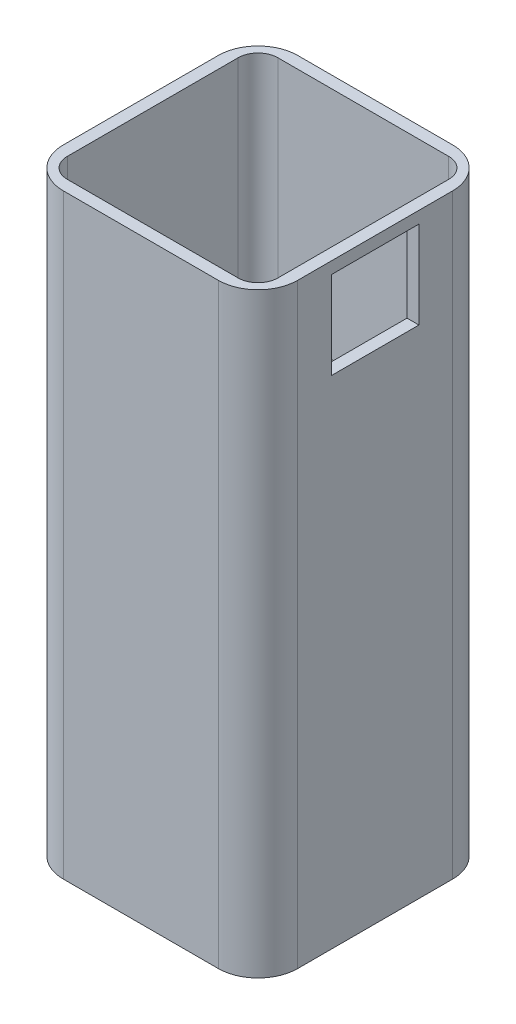
ISO-10303-21;
HEADER;
FILE_DESCRIPTION(('STEP AP214'),'2;1');
FILE_NAME('part.step','',(''),(''),'','','');
FILE_SCHEMA(('AUTOMOTIVE_DESIGN { 1 0 10303 214 1 1 1 1 }'));
ENDSEC;
DATA;
#1=APPLICATION_CONTEXT('core data for automotive mechanical design processes');
#2=APPLICATION_PROTOCOL_DEFINITION('international standard','automotive_design',2000,#1);
#3=PRODUCT_CONTEXT('',#1,'mechanical');
#4=PRODUCT('Part','Part','',(#3));
#5=PRODUCT_RELATED_PRODUCT_CATEGORY('part','',(#4));
#6=PRODUCT_DEFINITION_FORMATION('','',#4);
#7=PRODUCT_DEFINITION_CONTEXT('part definition',#1,'design');
#8=PRODUCT_DEFINITION('design','',#6,#7);
#9=PRODUCT_DEFINITION_SHAPE('','',#8);
#10=(LENGTH_UNIT() NAMED_UNIT(*) SI_UNIT(.MILLI.,.METRE.));
#11=(NAMED_UNIT(*) PLANE_ANGLE_UNIT() SI_UNIT($,.RADIAN.));
#12=(NAMED_UNIT(*) SI_UNIT($,.STERADIAN.) SOLID_ANGLE_UNIT());
#13=UNCERTAINTY_MEASURE_WITH_UNIT(LENGTH_MEASURE(1.E-05),#10,'distance_accuracy_value','');
#14=(GEOMETRIC_REPRESENTATION_CONTEXT(3) GLOBAL_UNCERTAINTY_ASSIGNED_CONTEXT((#13)) GLOBAL_UNIT_ASSIGNED_CONTEXT((#10,
#11,#12)) REPRESENTATION_CONTEXT('',''));
#15=CARTESIAN_POINT('',(0.,0.,0.));
#16=DIRECTION('',(0.,0.,1.));
#17=DIRECTION('',(1.,0.,0.));
#18=AXIS2_PLACEMENT_3D('',#15,#16,#17);
#19=CARTESIAN_POINT('',(0.,150.,0.));
#20=DIRECTION('',(0.,-1.,0.));
#21=DIRECTION('',(0.,0.,-1.));
#22=AXIS2_PLACEMENT_3D('',#19,#20,#21);
#23=PLANE('',#22);
#24=DIRECTION('',(0.,0.,-1.));
#25=VECTOR('',#24,1.);
#26=CARTESIAN_POINT('',(29.5,150.,29.5));
#27=LINE('',#26,#25);
#28=CARTESIAN_POINT('',(29.5,150.,19.5));
#29=VERTEX_POINT('',#28);
#30=CARTESIAN_POINT('',(29.5,150.,-19.5));
#31=VERTEX_POINT('',#30);
#32=EDGE_CURVE('E323',#29,#31,#27,.T.);
#33=ORIENTED_EDGE('',*,*,#32,.T.);
#34=CARTESIAN_POINT('',(19.5,150.,-19.5));
#35=DIRECTION('',(0.,-1.,0.));
#36=DIRECTION('',(0.,0.,-1.));
#37=AXIS2_PLACEMENT_3D('',#34,#35,#36);
#38=CIRCLE('',#37,10.);
#39=CARTESIAN_POINT('',(19.5,150.,-29.5));
#40=VERTEX_POINT('',#39);
#41=EDGE_CURVE('E389',#31,#40,#38,.F.);
#42=ORIENTED_EDGE('',*,*,#41,.T.);
#43=DIRECTION('',(-1.,0.,0.));
#44=VECTOR('',#43,1.);
#45=CARTESIAN_POINT('',(-29.5,150.,-29.5));
#46=LINE('',#45,#44);
#47=CARTESIAN_POINT('',(-19.5,150.,-29.5));
#48=VERTEX_POINT('',#47);
#49=EDGE_CURVE('E327',#40,#48,#46,.T.);
#50=ORIENTED_EDGE('',*,*,#49,.T.);
#51=CARTESIAN_POINT('',(-19.5,150.,-19.5));
#52=DIRECTION('',(0.,-1.,0.));
#53=DIRECTION('',(0.,0.,-1.));
#54=AXIS2_PLACEMENT_3D('',#51,#52,#53);
#55=CIRCLE('',#54,10.);
#56=CARTESIAN_POINT('',(-29.5,150.,-19.5));
#57=VERTEX_POINT('',#56);
#58=EDGE_CURVE('E380',#48,#57,#55,.F.);
#59=ORIENTED_EDGE('',*,*,#58,.T.);
#60=DIRECTION('',(0.,0.,1.));
#61=VECTOR('',#60,1.);
#62=CARTESIAN_POINT('',(-29.5,150.,29.5));
#63=LINE('',#62,#61);
#64=CARTESIAN_POINT('',(-29.5,150.,19.5));
#65=VERTEX_POINT('',#64);
#66=EDGE_CURVE('E332',#57,#65,#63,.T.);
#67=ORIENTED_EDGE('',*,*,#66,.T.);
#68=CARTESIAN_POINT('',(-19.5,150.,19.5));
#69=DIRECTION('',(0.,-1.,0.));
#70=DIRECTION('',(0.,0.,-1.));
#71=AXIS2_PLACEMENT_3D('',#68,#69,#70);
#72=CIRCLE('',#71,10.);
#73=CARTESIAN_POINT('',(-19.5,150.,29.5));
#74=VERTEX_POINT('',#73);
#75=EDGE_CURVE('E383',#65,#74,#72,.F.);
#76=ORIENTED_EDGE('',*,*,#75,.T.);
#77=DIRECTION('',(1.,0.,0.));
#78=VECTOR('',#77,1.);
#79=CARTESIAN_POINT('',(-29.5,150.,29.5));
#80=LINE('',#79,#78);
#81=CARTESIAN_POINT('',(19.5,150.,29.5));
#82=VERTEX_POINT('',#81);
#83=EDGE_CURVE('E336',#74,#82,#80,.T.);
#84=ORIENTED_EDGE('',*,*,#83,.T.);
#85=CARTESIAN_POINT('',(19.5,150.,19.5));
#86=DIRECTION('',(0.,-1.,0.));
#87=DIRECTION('',(0.,0.,-1.));
#88=AXIS2_PLACEMENT_3D('',#85,#86,#87);
#89=CIRCLE('',#88,10.);
#90=EDGE_CURVE('E386',#82,#29,#89,.F.);
#91=ORIENTED_EDGE('',*,*,#90,.T.);
#92=EDGE_LOOP('',(#33,#42,#50,#59,#67,#76,#84,#91));
#93=FACE_BOUND('',#92,.T.);
#94=DIRECTION('',(0.,0.,-1.));
#95=VECTOR('',#94,1.);
#96=CARTESIAN_POINT('',(26.5,150.,26.5));
#97=LINE('',#96,#95);
#98=CARTESIAN_POINT('',(26.5,150.,21.5));
#99=VERTEX_POINT('',#98);
#100=CARTESIAN_POINT('',(26.5,150.,-21.5));
#101=VERTEX_POINT('',#100);
#102=EDGE_CURVE('E291',#99,#101,#97,.T.);
#103=ORIENTED_EDGE('',*,*,#102,.F.);
#104=CARTESIAN_POINT('',(21.5,150.,21.5));
#105=DIRECTION('',(0.,-1.,0.));
#106=DIRECTION('',(0.,0.,-1.));
#107=AXIS2_PLACEMENT_3D('',#104,#105,#106);
#108=CIRCLE('',#107,5.);
#109=CARTESIAN_POINT('',(21.5,150.,26.5));
#110=VERTEX_POINT('',#109);
#111=EDGE_CURVE('E449',#99,#110,#108,.T.);
#112=ORIENTED_EDGE('',*,*,#111,.T.);
#113=DIRECTION('',(1.,0.,0.));
#114=VECTOR('',#113,1.);
#115=CARTESIAN_POINT('',(-26.5,150.,26.5));
#116=LINE('',#115,#114);
#117=CARTESIAN_POINT('',(-21.5,150.,26.5));
#118=VERTEX_POINT('',#117);
#119=EDGE_CURVE('E304',#118,#110,#116,.T.);
#120=ORIENTED_EDGE('',*,*,#119,.F.);
#121=CARTESIAN_POINT('',(-21.5,150.,21.5));
#122=DIRECTION('',(0.,-1.,0.));
#123=DIRECTION('',(0.,0.,-1.));
#124=AXIS2_PLACEMENT_3D('',#121,#122,#123);
#125=CIRCLE('',#124,5.);
#126=CARTESIAN_POINT('',(-26.5,150.,21.5));
#127=VERTEX_POINT('',#126);
#128=EDGE_CURVE('E443',#118,#127,#125,.T.);
#129=ORIENTED_EDGE('',*,*,#128,.T.);
#130=DIRECTION('',(0.,0.,1.));
#131=VECTOR('',#130,1.);
#132=CARTESIAN_POINT('',(-26.5,150.,26.5));
#133=LINE('',#132,#131);
#134=CARTESIAN_POINT('',(-26.5,150.,-21.5));
#135=VERTEX_POINT('',#134);
#136=EDGE_CURVE('E300',#135,#127,#133,.T.);
#137=ORIENTED_EDGE('',*,*,#136,.F.);
#138=CARTESIAN_POINT('',(-21.5,150.,-21.5));
#139=DIRECTION('',(0.,-1.,0.));
#140=DIRECTION('',(0.,0.,-1.));
#141=AXIS2_PLACEMENT_3D('',#138,#139,#140);
#142=CIRCLE('',#141,5.);
#143=CARTESIAN_POINT('',(-21.5,150.,-26.5));
#144=VERTEX_POINT('',#143);
#145=EDGE_CURVE('E437',#135,#144,#142,.T.);
#146=ORIENTED_EDGE('',*,*,#145,.T.);
#147=DIRECTION('',(-1.,0.,0.));
#148=VECTOR('',#147,1.);
#149=CARTESIAN_POINT('',(-26.5,150.,-26.5));
#150=LINE('',#149,#148);
#151=CARTESIAN_POINT('',(21.5,150.,-26.5));
#152=VERTEX_POINT('',#151);
#153=EDGE_CURVE('E295',#152,#144,#150,.T.);
#154=ORIENTED_EDGE('',*,*,#153,.F.);
#155=CARTESIAN_POINT('',(21.5,150.,-21.5));
#156=DIRECTION('',(0.,-1.,0.));
#157=DIRECTION('',(0.,0.,-1.));
#158=AXIS2_PLACEMENT_3D('',#155,#156,#157);
#159=CIRCLE('',#158,5.);
#160=EDGE_CURVE('E11',#152,#101,#159,.T.);
#161=ORIENTED_EDGE('',*,*,#160,.T.);
#162=EDGE_LOOP('',(#103,#112,#120,#129,#137,#146,#154,#161));
#163=FACE_BOUND('',#162,.T.);
#164=ADVANCED_FACE('F39',(#93,#163),#23,.F.);
#165=CARTESIAN_POINT('',(0.,0.,0.));
#166=DIRECTION('',(0.,-1.,0.));
#167=DIRECTION('',(0.,0.,-1.));
#168=AXIS2_PLACEMENT_3D('',#165,#166,#167);
#169=PLANE('',#168);
#170=DIRECTION('',(-1.,0.,0.));
#171=VECTOR('',#170,1.);
#172=CARTESIAN_POINT('',(-29.5,0.,-29.5));
#173=LINE('',#172,#171);
#174=CARTESIAN_POINT('',(19.5,0.,-29.5));
#175=VERTEX_POINT('',#174);
#176=CARTESIAN_POINT('',(-19.5,0.,-29.5));
#177=VERTEX_POINT('',#176);
#178=EDGE_CURVE('E344',#175,#177,#173,.T.);
#179=ORIENTED_EDGE('',*,*,#178,.F.);
#180=CARTESIAN_POINT('',(19.5,0.,-19.5));
#181=DIRECTION('',(0.,-1.,0.));
#182=DIRECTION('',(0.,0.,-1.));
#183=AXIS2_PLACEMENT_3D('',#180,#181,#182);
#184=CIRCLE('',#183,10.);
#185=CARTESIAN_POINT('',(29.5,0.,-19.5));
#186=VERTEX_POINT('',#185);
#187=EDGE_CURVE('E370',#175,#186,#184,.T.);
#188=ORIENTED_EDGE('',*,*,#187,.T.);
#189=DIRECTION('',(0.,0.,-1.));
#190=VECTOR('',#189,1.);
#191=CARTESIAN_POINT('',(29.5,0.,29.5));
#192=LINE('',#191,#190);
#193=CARTESIAN_POINT('',(29.5,0.,19.5));
#194=VERTEX_POINT('',#193);
#195=EDGE_CURVE('E308',#194,#186,#192,.T.);
#196=ORIENTED_EDGE('',*,*,#195,.F.);
#197=CARTESIAN_POINT('',(19.5,0.,19.5));
#198=DIRECTION('',(0.,-1.,0.));
#199=DIRECTION('',(0.,0.,-1.));
#200=AXIS2_PLACEMENT_3D('',#197,#198,#199);
#201=CIRCLE('',#200,10.);
#202=CARTESIAN_POINT('',(19.5,0.,29.5));
#203=VERTEX_POINT('',#202);
#204=EDGE_CURVE('E367',#194,#203,#201,.T.);
#205=ORIENTED_EDGE('',*,*,#204,.T.);
#206=DIRECTION('',(1.,0.,0.));
#207=VECTOR('',#206,1.);
#208=CARTESIAN_POINT('',(-29.5,0.,29.5));
#209=LINE('',#208,#207);
#210=CARTESIAN_POINT('',(-19.5,0.,29.5));
#211=VERTEX_POINT('',#210);
#212=EDGE_CURVE('E328',#211,#203,#209,.T.);
#213=ORIENTED_EDGE('',*,*,#212,.F.);
#214=CARTESIAN_POINT('',(-19.5,0.,19.5));
#215=DIRECTION('',(0.,-1.,0.));
#216=DIRECTION('',(0.,0.,-1.));
#217=AXIS2_PLACEMENT_3D('',#214,#215,#216);
#218=CIRCLE('',#217,10.);
#219=CARTESIAN_POINT('',(-29.5,0.,19.5));
#220=VERTEX_POINT('',#219);
#221=EDGE_CURVE('E364',#211,#220,#218,.T.);
#222=ORIENTED_EDGE('',*,*,#221,.T.);
#223=DIRECTION('',(0.,0.,1.));
#224=VECTOR('',#223,1.);
#225=CARTESIAN_POINT('',(-29.5,0.,29.5));
#226=LINE('',#225,#224);
#227=CARTESIAN_POINT('',(-29.5,0.,-19.5));
#228=VERTEX_POINT('',#227);
#229=EDGE_CURVE('E348',#228,#220,#226,.T.);
#230=ORIENTED_EDGE('',*,*,#229,.F.);
#231=CARTESIAN_POINT('',(-19.5,0.,-19.5));
#232=DIRECTION('',(0.,-1.,0.));
#233=DIRECTION('',(0.,0.,-1.));
#234=AXIS2_PLACEMENT_3D('',#231,#232,#233);
#235=CIRCLE('',#234,10.);
#236=EDGE_CURVE('E361',#228,#177,#235,.T.);
#237=ORIENTED_EDGE('',*,*,#236,.T.);
#238=EDGE_LOOP('',(#179,#188,#196,#205,#213,#222,#230,#237));
#239=FACE_BOUND('',#238,.T.);
#240=DIRECTION('',(0.,0.,1.));
#241=VECTOR('',#240,1.);
#242=CARTESIAN_POINT('',(-26.5,0.,26.5));
#243=LINE('',#242,#241);
#244=CARTESIAN_POINT('',(-26.5,0.,-21.5));
#245=VERTEX_POINT('',#244);
#246=CARTESIAN_POINT('',(-26.5,0.,21.5));
#247=VERTEX_POINT('',#246);
#248=EDGE_CURVE('E316',#245,#247,#243,.T.);
#249=ORIENTED_EDGE('',*,*,#248,.T.);
#250=CARTESIAN_POINT('',(-21.5,0.,21.5));
#251=DIRECTION('',(0.,-1.,0.));
#252=DIRECTION('',(0.,0.,-1.));
#253=AXIS2_PLACEMENT_3D('',#250,#251,#252);
#254=CIRCLE('',#253,5.);
#255=CARTESIAN_POINT('',(-21.5,0.,26.5));
#256=VERTEX_POINT('',#255);
#257=EDGE_CURVE('E440',#247,#256,#254,.F.);
#258=ORIENTED_EDGE('',*,*,#257,.T.);
#259=DIRECTION('',(1.,0.,0.));
#260=VECTOR('',#259,1.);
#261=CARTESIAN_POINT('',(-26.5,0.,26.5));
#262=LINE('',#261,#260);
#263=CARTESIAN_POINT('',(21.5,0.,26.5));
#264=VERTEX_POINT('',#263);
#265=EDGE_CURVE('E296',#256,#264,#262,.T.);
#266=ORIENTED_EDGE('',*,*,#265,.T.);
#267=CARTESIAN_POINT('',(21.5,0.,21.5));
#268=DIRECTION('',(0.,-1.,0.));
#269=DIRECTION('',(0.,0.,-1.));
#270=AXIS2_PLACEMENT_3D('',#267,#268,#269);
#271=CIRCLE('',#270,5.);
#272=CARTESIAN_POINT('',(26.5,0.,21.5));
#273=VERTEX_POINT('',#272);
#274=EDGE_CURVE('E446',#264,#273,#271,.F.);
#275=ORIENTED_EDGE('',*,*,#274,.T.);
#276=DIRECTION('',(0.,0.,-1.));
#277=VECTOR('',#276,1.);
#278=CARTESIAN_POINT('',(26.5,0.,26.5));
#279=LINE('',#278,#277);
#280=CARTESIAN_POINT('',(26.5,0.,-21.5));
#281=VERTEX_POINT('',#280);
#282=EDGE_CURVE('E281',#273,#281,#279,.T.);
#283=ORIENTED_EDGE('',*,*,#282,.T.);
#284=CARTESIAN_POINT('',(21.5,0.,-21.5));
#285=DIRECTION('',(0.,-1.,0.));
#286=DIRECTION('',(0.,0.,-1.));
#287=AXIS2_PLACEMENT_3D('',#284,#285,#286);
#288=CIRCLE('',#287,5.);
#289=CARTESIAN_POINT('',(21.5,0.,-26.5));
#290=VERTEX_POINT('',#289);
#291=EDGE_CURVE('E48',#281,#290,#288,.F.);
#292=ORIENTED_EDGE('',*,*,#291,.T.);
#293=DIRECTION('',(-1.,0.,0.));
#294=VECTOR('',#293,1.);
#295=CARTESIAN_POINT('',(-26.5,0.,-26.5));
#296=LINE('',#295,#294);
#297=CARTESIAN_POINT('',(-21.5,0.,-26.5));
#298=VERTEX_POINT('',#297);
#299=EDGE_CURVE('E312',#290,#298,#296,.T.);
#300=ORIENTED_EDGE('',*,*,#299,.T.);
#301=CARTESIAN_POINT('',(-21.5,0.,-21.5));
#302=DIRECTION('',(0.,-1.,0.));
#303=DIRECTION('',(0.,0.,-1.));
#304=AXIS2_PLACEMENT_3D('',#301,#302,#303);
#305=CIRCLE('',#304,5.);
#306=EDGE_CURVE('E434',#298,#245,#305,.F.);
#307=ORIENTED_EDGE('',*,*,#306,.T.);
#308=EDGE_LOOP('',(#249,#258,#266,#275,#283,#292,#300,#307));
#309=FACE_BOUND('',#308,.T.);
#310=ADVANCED_FACE('F454',(#239,#309),#169,.T.);
#311=CARTESIAN_POINT('',(29.5,150.,29.5));
#312=DIRECTION('',(-1.,0.,0.));
#313=DIRECTION('',(0.,0.,1.));
#314=AXIS2_PLACEMENT_3D('',#311,#312,#313);
#315=PLANE('',#314);
#316=DIRECTION('',(0.,0.,1.));
#317=VECTOR('',#316,1.);
#318=CARTESIAN_POINT('',(29.5,147.,11.));
#319=LINE('',#318,#317);
#320=CARTESIAN_POINT('',(29.5,147.,-11.));
#321=VERTEX_POINT('',#320);
#322=CARTESIAN_POINT('',(29.5,147.,11.));
#323=VERTEX_POINT('',#322);
#324=EDGE_CURVE('E225',#321,#323,#319,.T.);
#325=ORIENTED_EDGE('',*,*,#324,.F.);
#326=DIRECTION('',(0.,1.,0.));
#327=VECTOR('',#326,1.);
#328=CARTESIAN_POINT('',(29.5,125.,-11.));
#329=LINE('',#328,#327);
#330=CARTESIAN_POINT('',(29.5,125.,-11.));
#331=VERTEX_POINT('',#330);
#332=EDGE_CURVE('E55',#331,#321,#329,.T.);
#333=ORIENTED_EDGE('',*,*,#332,.F.);
#334=DIRECTION('',(0.,0.,-1.));
#335=VECTOR('',#334,1.);
#336=CARTESIAN_POINT('',(29.5,125.,11.));
#337=LINE('',#336,#335);
#338=CARTESIAN_POINT('',(29.5,125.,11.));
#339=VERTEX_POINT('',#338);
#340=EDGE_CURVE('E211',#339,#331,#337,.T.);
#341=ORIENTED_EDGE('',*,*,#340,.F.);
#342=DIRECTION('',(0.,-1.,0.));
#343=VECTOR('',#342,1.);
#344=CARTESIAN_POINT('',(29.5,125.,11.));
#345=LINE('',#344,#343);
#346=EDGE_CURVE('E220',#323,#339,#345,.T.);
#347=ORIENTED_EDGE('',*,*,#346,.F.);
#348=EDGE_LOOP('',(#325,#333,#341,#347));
#349=FACE_BOUND('',#348,.T.);
#350=ORIENTED_EDGE('',*,*,#195,.T.);
#351=DIRECTION('',(0.,-1.,0.));
#352=VECTOR('',#351,1.);
#353=CARTESIAN_POINT('',(29.5,150.,-19.5));
#354=LINE('',#353,#352);
#355=EDGE_CURVE('E377',#186,#31,#354,.F.);
#356=ORIENTED_EDGE('',*,*,#355,.T.);
#357=ORIENTED_EDGE('',*,*,#32,.F.);
#358=DIRECTION('',(0.,-1.,0.));
#359=VECTOR('',#358,1.);
#360=CARTESIAN_POINT('',(29.5,150.,19.5));
#361=LINE('',#360,#359);
#362=EDGE_CURVE('E373',#29,#194,#361,.T.);
#363=ORIENTED_EDGE('',*,*,#362,.T.);
#364=EDGE_LOOP('',(#350,#356,#357,#363));
#365=FACE_BOUND('',#364,.T.);
#366=ADVANCED_FACE('F223',(#349,#365),#315,.F.);
#367=CARTESIAN_POINT('',(-29.5,150.,-29.5));
#368=DIRECTION('',(0.,0.,1.));
#369=DIRECTION('',(1.,0.,0.));
#370=AXIS2_PLACEMENT_3D('',#367,#368,#369);
#371=PLANE('',#370);
#372=DIRECTION('',(1.,0.,0.));
#373=VECTOR('',#372,1.);
#374=CARTESIAN_POINT('',(11.,91.,-29.5));
#375=LINE('',#374,#373);
#376=CARTESIAN_POINT('',(-11.,91.,-29.5));
#377=VERTEX_POINT('',#376);
#378=CARTESIAN_POINT('',(11.,91.,-29.5));
#379=VERTEX_POINT('',#378);
#380=EDGE_CURVE('E267',#377,#379,#375,.T.);
#381=ORIENTED_EDGE('',*,*,#380,.F.);
#382=DIRECTION('',(0.,1.,0.));
#383=VECTOR('',#382,1.);
#384=CARTESIAN_POINT('',(-11.,69.,-29.5));
#385=LINE('',#384,#383);
#386=CARTESIAN_POINT('',(-11.,69.,-29.5));
#387=VERTEX_POINT('',#386);
#388=EDGE_CURVE('E219',#387,#377,#385,.T.);
#389=ORIENTED_EDGE('',*,*,#388,.F.);
#390=DIRECTION('',(-1.,0.,0.));
#391=VECTOR('',#390,1.);
#392=CARTESIAN_POINT('',(11.,69.,-29.5));
#393=LINE('',#392,#391);
#394=CARTESIAN_POINT('',(11.,69.,-29.5));
#395=VERTEX_POINT('',#394);
#396=EDGE_CURVE('E252',#395,#387,#393,.T.);
#397=ORIENTED_EDGE('',*,*,#396,.F.);
#398=DIRECTION('',(0.,-1.,0.));
#399=VECTOR('',#398,1.);
#400=CARTESIAN_POINT('',(11.,69.,-29.5));
#401=LINE('',#400,#399);
#402=EDGE_CURVE('E271',#379,#395,#401,.T.);
#403=ORIENTED_EDGE('',*,*,#402,.F.);
#404=EDGE_LOOP('',(#381,#389,#397,#403));
#405=FACE_BOUND('',#404,.T.);
#406=ORIENTED_EDGE('',*,*,#49,.F.);
#407=DIRECTION('',(0.,-1.,0.));
#408=VECTOR('',#407,1.);
#409=CARTESIAN_POINT('',(19.5,150.,-29.5));
#410=LINE('',#409,#408);
#411=EDGE_CURVE('E357',#40,#175,#410,.T.);
#412=ORIENTED_EDGE('',*,*,#411,.T.);
#413=ORIENTED_EDGE('',*,*,#178,.T.);
#414=DIRECTION('',(0.,-1.,0.));
#415=VECTOR('',#414,1.);
#416=CARTESIAN_POINT('',(-19.5,150.,-29.5));
#417=LINE('',#416,#415);
#418=EDGE_CURVE('E340',#177,#48,#417,.F.);
#419=ORIENTED_EDGE('',*,*,#418,.T.);
#420=EDGE_LOOP('',(#406,#412,#413,#419));
#421=FACE_BOUND('',#420,.T.);
#422=ADVANCED_FACE('F519',(#405,#421),#371,.F.);
#423=CARTESIAN_POINT('',(-29.5,150.,29.5));
#424=DIRECTION('',(1.,0.,0.));
#425=DIRECTION('',(0.,0.,-1.));
#426=AXIS2_PLACEMENT_3D('',#423,#424,#425);
#427=PLANE('',#426);
#428=ORIENTED_EDGE('',*,*,#229,.T.);
#429=DIRECTION('',(0.,-1.,0.));
#430=VECTOR('',#429,1.);
#431=CARTESIAN_POINT('',(-29.5,150.,19.5));
#432=LINE('',#431,#430);
#433=EDGE_CURVE('E403',#220,#65,#432,.F.);
#434=ORIENTED_EDGE('',*,*,#433,.T.);
#435=ORIENTED_EDGE('',*,*,#66,.F.);
#436=DIRECTION('',(0.,-1.,0.));
#437=VECTOR('',#436,1.);
#438=CARTESIAN_POINT('',(-29.5,150.,-19.5));
#439=LINE('',#438,#437);
#440=EDGE_CURVE('E399',#57,#228,#439,.T.);
#441=ORIENTED_EDGE('',*,*,#440,.T.);
#442=EDGE_LOOP('',(#428,#434,#435,#441));
#443=FACE_BOUND('',#442,.T.);
#444=ADVANCED_FACE('F515',(#443),#427,.F.);
#445=CARTESIAN_POINT('',(-29.5,150.,29.5));
#446=DIRECTION('',(0.,0.,-1.));
#447=DIRECTION('',(-1.,0.,0.));
#448=AXIS2_PLACEMENT_3D('',#445,#446,#447);
#449=PLANE('',#448);
#450=ORIENTED_EDGE('',*,*,#212,.T.);
#451=DIRECTION('',(0.,-1.,0.));
#452=VECTOR('',#451,1.);
#453=CARTESIAN_POINT('',(19.5,150.,29.5));
#454=LINE('',#453,#452);
#455=EDGE_CURVE('E396',#203,#82,#454,.F.);
#456=ORIENTED_EDGE('',*,*,#455,.T.);
#457=ORIENTED_EDGE('',*,*,#83,.F.);
#458=DIRECTION('',(0.,-1.,0.));
#459=VECTOR('',#458,1.);
#460=CARTESIAN_POINT('',(-19.5,150.,29.5));
#461=LINE('',#460,#459);
#462=EDGE_CURVE('E392',#74,#211,#461,.T.);
#463=ORIENTED_EDGE('',*,*,#462,.T.);
#464=EDGE_LOOP('',(#450,#456,#457,#463));
#465=FACE_BOUND('',#464,.T.);
#466=ADVANCED_FACE('F512',(#465),#449,.F.);
#467=CARTESIAN_POINT('',(26.5,150.,26.5));
#468=DIRECTION('',(-1.,0.,0.));
#469=DIRECTION('',(0.,0.,1.));
#470=AXIS2_PLACEMENT_3D('',#467,#468,#469);
#471=PLANE('',#470);
#472=DIRECTION('',(0.,1.,0.));
#473=VECTOR('',#472,1.);
#474=CARTESIAN_POINT('',(26.5,125.,-11.));
#475=LINE('',#474,#473);
#476=CARTESIAN_POINT('',(26.5,125.,-11.));
#477=VERTEX_POINT('',#476);
#478=CARTESIAN_POINT('',(26.5,147.,-11.));
#479=VERTEX_POINT('',#478);
#480=EDGE_CURVE('E203',#477,#479,#475,.T.);
#481=ORIENTED_EDGE('',*,*,#480,.T.);
#482=DIRECTION('',(0.,0.,1.));
#483=VECTOR('',#482,1.);
#484=CARTESIAN_POINT('',(26.5,147.,11.));
#485=LINE('',#484,#483);
#486=CARTESIAN_POINT('',(26.5,147.,11.));
#487=VERTEX_POINT('',#486);
#488=EDGE_CURVE('E231',#479,#487,#485,.T.);
#489=ORIENTED_EDGE('',*,*,#488,.T.);
#490=DIRECTION('',(0.,-1.,0.));
#491=VECTOR('',#490,1.);
#492=CARTESIAN_POINT('',(26.5,125.,11.));
#493=LINE('',#492,#491);
#494=CARTESIAN_POINT('',(26.5,125.,11.));
#495=VERTEX_POINT('',#494);
#496=EDGE_CURVE('E207',#487,#495,#493,.T.);
#497=ORIENTED_EDGE('',*,*,#496,.T.);
#498=DIRECTION('',(0.,0.,-1.));
#499=VECTOR('',#498,1.);
#500=CARTESIAN_POINT('',(26.5,125.,11.));
#501=LINE('',#500,#499);
#502=EDGE_CURVE('E208',#495,#477,#501,.T.);
#503=ORIENTED_EDGE('',*,*,#502,.T.);
#504=EDGE_LOOP('',(#481,#489,#497,#503));
#505=FACE_BOUND('',#504,.T.);
#506=ORIENTED_EDGE('',*,*,#282,.F.);
#507=DIRECTION('',(0.,-1.,0.));
#508=VECTOR('',#507,1.);
#509=CARTESIAN_POINT('',(26.5,150.,21.5));
#510=LINE('',#509,#508);
#511=EDGE_CURVE('E431',#273,#99,#510,.F.);
#512=ORIENTED_EDGE('',*,*,#511,.T.);
#513=ORIENTED_EDGE('',*,*,#102,.T.);
#514=DIRECTION('',(0.,-1.,0.));
#515=VECTOR('',#514,1.);
#516=CARTESIAN_POINT('',(26.5,0.,-21.5));
#517=LINE('',#516,#515);
#518=EDGE_CURVE('E427',#101,#281,#517,.T.);
#519=ORIENTED_EDGE('',*,*,#518,.T.);
#520=EDGE_LOOP('',(#506,#512,#513,#519));
#521=FACE_BOUND('',#520,.T.);
#522=ADVANCED_FACE('F468',(#505,#521),#471,.T.);
#523=CARTESIAN_POINT('',(-26.5,150.,-26.5));
#524=DIRECTION('',(0.,0.,1.));
#525=DIRECTION('',(1.,0.,0.));
#526=AXIS2_PLACEMENT_3D('',#523,#524,#525);
#527=PLANE('',#526);
#528=DIRECTION('',(0.,1.,0.));
#529=VECTOR('',#528,1.);
#530=CARTESIAN_POINT('',(-11.,69.,-26.5));
#531=LINE('',#530,#529);
#532=CARTESIAN_POINT('',(-11.,69.,-26.5));
#533=VERTEX_POINT('',#532);
#534=CARTESIAN_POINT('',(-11.,91.,-26.5));
#535=VERTEX_POINT('',#534);
#536=EDGE_CURVE('E247',#533,#535,#531,.T.);
#537=ORIENTED_EDGE('',*,*,#536,.T.);
#538=DIRECTION('',(1.,0.,0.));
#539=VECTOR('',#538,1.);
#540=CARTESIAN_POINT('',(11.,91.,-26.5));
#541=LINE('',#540,#539);
#542=CARTESIAN_POINT('',(11.,91.,-26.5));
#543=VERTEX_POINT('',#542);
#544=EDGE_CURVE('E251',#535,#543,#541,.T.);
#545=ORIENTED_EDGE('',*,*,#544,.T.);
#546=DIRECTION('',(0.,-1.,0.));
#547=VECTOR('',#546,1.);
#548=CARTESIAN_POINT('',(11.,69.,-26.5));
#549=LINE('',#548,#547);
#550=CARTESIAN_POINT('',(11.,69.,-26.5));
#551=VERTEX_POINT('',#550);
#552=EDGE_CURVE('E256',#543,#551,#549,.T.);
#553=ORIENTED_EDGE('',*,*,#552,.T.);
#554=DIRECTION('',(-1.,0.,0.));
#555=VECTOR('',#554,1.);
#556=CARTESIAN_POINT('',(11.,69.,-26.5));
#557=LINE('',#556,#555);
#558=EDGE_CURVE('E260',#551,#533,#557,.T.);
#559=ORIENTED_EDGE('',*,*,#558,.T.);
#560=EDGE_LOOP('',(#537,#545,#553,#559));
#561=FACE_BOUND('',#560,.T.);
#562=ORIENTED_EDGE('',*,*,#153,.T.);
#563=DIRECTION('',(0.,-1.,0.));
#564=VECTOR('',#563,1.);
#565=CARTESIAN_POINT('',(-21.5,0.,-26.5));
#566=LINE('',#565,#564);
#567=EDGE_CURVE('E409',#144,#298,#566,.T.);
#568=ORIENTED_EDGE('',*,*,#567,.T.);
#569=ORIENTED_EDGE('',*,*,#299,.F.);
#570=DIRECTION('',(0.,-1.,0.));
#571=VECTOR('',#570,1.);
#572=CARTESIAN_POINT('',(21.5,150.,-26.5));
#573=LINE('',#572,#571);
#574=EDGE_CURVE('E406',#290,#152,#573,.F.);
#575=ORIENTED_EDGE('',*,*,#574,.T.);
#576=EDGE_LOOP('',(#562,#568,#569,#575));
#577=FACE_BOUND('',#576,.T.);
#578=ADVANCED_FACE('F460',(#561,#577),#527,.T.);
#579=CARTESIAN_POINT('',(-26.5,150.,26.5));
#580=DIRECTION('',(1.,0.,0.));
#581=DIRECTION('',(0.,0.,-1.));
#582=AXIS2_PLACEMENT_3D('',#579,#580,#581);
#583=PLANE('',#582);
#584=ORIENTED_EDGE('',*,*,#248,.F.);
#585=DIRECTION('',(0.,-1.,0.));
#586=VECTOR('',#585,1.);
#587=CARTESIAN_POINT('',(-26.5,150.,-21.5));
#588=LINE('',#587,#586);
#589=EDGE_CURVE('E417',#245,#135,#588,.F.);
#590=ORIENTED_EDGE('',*,*,#589,.T.);
#591=ORIENTED_EDGE('',*,*,#136,.T.);
#592=DIRECTION('',(0.,-1.,0.));
#593=VECTOR('',#592,1.);
#594=CARTESIAN_POINT('',(-26.5,0.,21.5));
#595=LINE('',#594,#593);
#596=EDGE_CURVE('E413',#127,#247,#595,.T.);
#597=ORIENTED_EDGE('',*,*,#596,.T.);
#598=EDGE_LOOP('',(#584,#590,#591,#597));
#599=FACE_BOUND('',#598,.T.);
#600=ADVANCED_FACE('F486',(#599),#583,.T.);
#601=CARTESIAN_POINT('',(-26.5,150.,26.5));
#602=DIRECTION('',(0.,0.,-1.));
#603=DIRECTION('',(-1.,0.,0.));
#604=AXIS2_PLACEMENT_3D('',#601,#602,#603);
#605=PLANE('',#604);
#606=ORIENTED_EDGE('',*,*,#265,.F.);
#607=DIRECTION('',(0.,-1.,0.));
#608=VECTOR('',#607,1.);
#609=CARTESIAN_POINT('',(-21.5,150.,26.5));
#610=LINE('',#609,#608);
#611=EDGE_CURVE('E424',#256,#118,#610,.F.);
#612=ORIENTED_EDGE('',*,*,#611,.T.);
#613=ORIENTED_EDGE('',*,*,#119,.T.);
#614=DIRECTION('',(0.,-1.,0.));
#615=VECTOR('',#614,1.);
#616=CARTESIAN_POINT('',(21.5,0.,26.5));
#617=LINE('',#616,#615);
#618=EDGE_CURVE('E420',#110,#264,#617,.T.);
#619=ORIENTED_EDGE('',*,*,#618,.T.);
#620=EDGE_LOOP('',(#606,#612,#613,#619));
#621=FACE_BOUND('',#620,.T.);
#622=ADVANCED_FACE('F477',(#621),#605,.T.);
#623=CARTESIAN_POINT('',(19.5,150.,-19.5));
#624=DIRECTION('',(0.,-1.,0.));
#625=DIRECTION('',(0.,0.,-1.));
#626=AXIS2_PLACEMENT_3D('',#623,#624,#625);
#627=CYLINDRICAL_SURFACE('',#626,10.);
#628=ORIENTED_EDGE('',*,*,#41,.F.);
#629=ORIENTED_EDGE('',*,*,#355,.F.);
#630=ORIENTED_EDGE('',*,*,#187,.F.);
#631=ORIENTED_EDGE('',*,*,#411,.F.);
#632=EDGE_LOOP('',(#628,#629,#630,#631));
#633=FACE_BOUND('',#632,.T.);
#634=ADVANCED_FACE('F526',(#633),#627,.T.);
#635=CARTESIAN_POINT('',(19.5,150.,19.5));
#636=DIRECTION('',(0.,-1.,0.));
#637=DIRECTION('',(0.,0.,-1.));
#638=AXIS2_PLACEMENT_3D('',#635,#636,#637);
#639=CYLINDRICAL_SURFACE('',#638,10.);
#640=ORIENTED_EDGE('',*,*,#90,.F.);
#641=ORIENTED_EDGE('',*,*,#455,.F.);
#642=ORIENTED_EDGE('',*,*,#204,.F.);
#643=ORIENTED_EDGE('',*,*,#362,.F.);
#644=EDGE_LOOP('',(#640,#641,#642,#643));
#645=FACE_BOUND('',#644,.T.);
#646=ADVANCED_FACE('F529',(#645),#639,.T.);
#647=CARTESIAN_POINT('',(-19.5,150.,19.5));
#648=DIRECTION('',(0.,-1.,0.));
#649=DIRECTION('',(0.,0.,-1.));
#650=AXIS2_PLACEMENT_3D('',#647,#648,#649);
#651=CYLINDRICAL_SURFACE('',#650,10.);
#652=ORIENTED_EDGE('',*,*,#75,.F.);
#653=ORIENTED_EDGE('',*,*,#433,.F.);
#654=ORIENTED_EDGE('',*,*,#221,.F.);
#655=ORIENTED_EDGE('',*,*,#462,.F.);
#656=EDGE_LOOP('',(#652,#653,#654,#655));
#657=FACE_BOUND('',#656,.T.);
#658=ADVANCED_FACE('F498',(#657),#651,.T.);
#659=CARTESIAN_POINT('',(-19.5,150.,-19.5));
#660=DIRECTION('',(0.,-1.,0.));
#661=DIRECTION('',(0.,0.,-1.));
#662=AXIS2_PLACEMENT_3D('',#659,#660,#661);
#663=CYLINDRICAL_SURFACE('',#662,10.);
#664=ORIENTED_EDGE('',*,*,#58,.F.);
#665=ORIENTED_EDGE('',*,*,#418,.F.);
#666=ORIENTED_EDGE('',*,*,#236,.F.);
#667=ORIENTED_EDGE('',*,*,#440,.F.);
#668=EDGE_LOOP('',(#664,#665,#666,#667));
#669=FACE_BOUND('',#668,.T.);
#670=ADVANCED_FACE('F491',(#669),#663,.T.);
#671=CARTESIAN_POINT('',(-21.5,150.,-21.5));
#672=DIRECTION('',(0.,1.,0.));
#673=DIRECTION('',(0.,0.,1.));
#674=AXIS2_PLACEMENT_3D('',#671,#672,#673);
#675=CYLINDRICAL_SURFACE('',#674,5.);
#676=ORIENTED_EDGE('',*,*,#145,.F.);
#677=ORIENTED_EDGE('',*,*,#589,.F.);
#678=ORIENTED_EDGE('',*,*,#306,.F.);
#679=ORIENTED_EDGE('',*,*,#567,.F.);
#680=EDGE_LOOP('',(#676,#677,#678,#679));
#681=FACE_BOUND('',#680,.T.);
#682=ADVANCED_FACE('F489',(#681),#675,.F.);
#683=CARTESIAN_POINT('',(-21.5,150.,21.5));
#684=DIRECTION('',(0.,1.,0.));
#685=DIRECTION('',(0.,0.,1.));
#686=AXIS2_PLACEMENT_3D('',#683,#684,#685);
#687=CYLINDRICAL_SURFACE('',#686,5.);
#688=ORIENTED_EDGE('',*,*,#128,.F.);
#689=ORIENTED_EDGE('',*,*,#611,.F.);
#690=ORIENTED_EDGE('',*,*,#257,.F.);
#691=ORIENTED_EDGE('',*,*,#596,.F.);
#692=EDGE_LOOP('',(#688,#689,#690,#691));
#693=FACE_BOUND('',#692,.T.);
#694=ADVANCED_FACE('F480',(#693),#687,.F.);
#695=CARTESIAN_POINT('',(21.5,150.,21.5));
#696=DIRECTION('',(0.,1.,0.));
#697=DIRECTION('',(0.,0.,1.));
#698=AXIS2_PLACEMENT_3D('',#695,#696,#697);
#699=CYLINDRICAL_SURFACE('',#698,5.);
#700=ORIENTED_EDGE('',*,*,#111,.F.);
#701=ORIENTED_EDGE('',*,*,#511,.F.);
#702=ORIENTED_EDGE('',*,*,#274,.F.);
#703=ORIENTED_EDGE('',*,*,#618,.F.);
#704=EDGE_LOOP('',(#700,#701,#702,#703));
#705=FACE_BOUND('',#704,.T.);
#706=ADVANCED_FACE('F471',(#705),#699,.F.);
#707=CARTESIAN_POINT('',(21.5,150.,-21.5));
#708=DIRECTION('',(0.,1.,0.));
#709=DIRECTION('',(0.,0.,1.));
#710=AXIS2_PLACEMENT_3D('',#707,#708,#709);
#711=CYLINDRICAL_SURFACE('',#710,5.);
#712=ORIENTED_EDGE('',*,*,#160,.F.);
#713=ORIENTED_EDGE('',*,*,#574,.F.);
#714=ORIENTED_EDGE('',*,*,#291,.F.);
#715=ORIENTED_EDGE('',*,*,#518,.F.);
#716=EDGE_LOOP('',(#712,#713,#714,#715));
#717=FACE_BOUND('',#716,.T.);
#718=ADVANCED_FACE('F41',(#717),#711,.F.);
#719=CARTESIAN_POINT('',(-11.,69.,-26.5));
#720=DIRECTION('',(-1.,0.,0.));
#721=DIRECTION('',(0.,-1.,0.));
#722=AXIS2_PLACEMENT_3D('',#719,#720,#721);
#723=PLANE('',#722);
#724=ORIENTED_EDGE('',*,*,#388,.T.);
#725=DIRECTION('',(0.,0.,-1.));
#726=VECTOR('',#725,1.);
#727=CARTESIAN_POINT('',(-11.,91.,-26.5));
#728=LINE('',#727,#726);
#729=EDGE_CURVE('E264',#535,#377,#728,.T.);
#730=ORIENTED_EDGE('',*,*,#729,.F.);
#731=ORIENTED_EDGE('',*,*,#536,.F.);
#732=DIRECTION('',(0.,0.,-1.));
#733=VECTOR('',#732,1.);
#734=CARTESIAN_POINT('',(-11.,69.,-26.5));
#735=LINE('',#734,#733);
#736=EDGE_CURVE('E278',#533,#387,#735,.T.);
#737=ORIENTED_EDGE('',*,*,#736,.T.);
#738=EDGE_LOOP('',(#724,#730,#731,#737));
#739=FACE_BOUND('',#738,.T.);
#740=ADVANCED_FACE('F621',(#739),#723,.F.);
#741=CARTESIAN_POINT('',(11.,69.,-26.5));
#742=DIRECTION('',(0.,-1.,0.));
#743=DIRECTION('',(1.,0.,0.));
#744=AXIS2_PLACEMENT_3D('',#741,#742,#743);
#745=PLANE('',#744);
#746=ORIENTED_EDGE('',*,*,#396,.T.);
#747=ORIENTED_EDGE('',*,*,#736,.F.);
#748=ORIENTED_EDGE('',*,*,#558,.F.);
#749=DIRECTION('',(0.,0.,-1.));
#750=VECTOR('',#749,1.);
#751=CARTESIAN_POINT('',(11.,69.,-26.5));
#752=LINE('',#751,#750);
#753=EDGE_CURVE('E282',#551,#395,#752,.T.);
#754=ORIENTED_EDGE('',*,*,#753,.T.);
#755=EDGE_LOOP('',(#746,#747,#748,#754));
#756=FACE_BOUND('',#755,.T.);
#757=ADVANCED_FACE('F644',(#756),#745,.F.);
#758=CARTESIAN_POINT('',(11.,69.,-26.5));
#759=DIRECTION('',(1.,0.,0.));
#760=DIRECTION('',(0.,1.,0.));
#761=AXIS2_PLACEMENT_3D('',#758,#759,#760);
#762=PLANE('',#761);
#763=ORIENTED_EDGE('',*,*,#402,.T.);
#764=ORIENTED_EDGE('',*,*,#753,.F.);
#765=ORIENTED_EDGE('',*,*,#552,.F.);
#766=DIRECTION('',(0.,0.,-1.));
#767=VECTOR('',#766,1.);
#768=CARTESIAN_POINT('',(11.,91.,-26.5));
#769=LINE('',#768,#767);
#770=EDGE_CURVE('E285',#543,#379,#769,.T.);
#771=ORIENTED_EDGE('',*,*,#770,.T.);
#772=EDGE_LOOP('',(#763,#764,#765,#771));
#773=FACE_BOUND('',#772,.T.);
#774=ADVANCED_FACE('F654',(#773),#762,.F.);
#775=CARTESIAN_POINT('',(11.,91.,-26.5));
#776=DIRECTION('',(0.,1.,0.));
#777=DIRECTION('',(0.,0.,1.));
#778=AXIS2_PLACEMENT_3D('',#775,#776,#777);
#779=PLANE('',#778);
#780=ORIENTED_EDGE('',*,*,#380,.T.);
#781=ORIENTED_EDGE('',*,*,#770,.F.);
#782=ORIENTED_EDGE('',*,*,#544,.F.);
#783=ORIENTED_EDGE('',*,*,#729,.T.);
#784=EDGE_LOOP('',(#780,#781,#782,#783));
#785=FACE_BOUND('',#784,.T.);
#786=ADVANCED_FACE('F664',(#785),#779,.F.);
#787=CARTESIAN_POINT('',(-29.501,125.,-11.));
#788=DIRECTION('',(0.,0.,-1.));
#789=DIRECTION('',(-1.,0.,0.));
#790=AXIS2_PLACEMENT_3D('',#787,#788,#789);
#791=PLANE('',#790);
#792=DIRECTION('',(1.,0.,0.));
#793=VECTOR('',#792,1.);
#794=CARTESIAN_POINT('',(-29.501,125.,-11.));
#795=LINE('',#794,#793);
#796=EDGE_CURVE('E199',#477,#331,#795,.T.);
#797=ORIENTED_EDGE('',*,*,#796,.T.);
#798=ORIENTED_EDGE('',*,*,#332,.T.);
#799=DIRECTION('',(1.,0.,0.));
#800=VECTOR('',#799,1.);
#801=CARTESIAN_POINT('',(-29.501,147.,-11.));
#802=LINE('',#801,#800);
#803=EDGE_CURVE('E237',#479,#321,#802,.T.);
#804=ORIENTED_EDGE('',*,*,#803,.F.);
#805=ORIENTED_EDGE('',*,*,#480,.F.);
#806=EDGE_LOOP('',(#797,#798,#804,#805));
#807=FACE_BOUND('',#806,.T.);
#808=ADVANCED_FACE('F201',(#807),#791,.F.);
#809=CARTESIAN_POINT('',(-29.501,125.,11.));
#810=DIRECTION('',(0.,-1.,0.));
#811=DIRECTION('',(0.,0.,-1.));
#812=AXIS2_PLACEMENT_3D('',#809,#810,#811);
#813=PLANE('',#812);
#814=DIRECTION('',(1.,0.,0.));
#815=VECTOR('',#814,1.);
#816=CARTESIAN_POINT('',(-29.501,125.,11.));
#817=LINE('',#816,#815);
#818=EDGE_CURVE('E214',#495,#339,#817,.T.);
#819=ORIENTED_EDGE('',*,*,#818,.T.);
#820=ORIENTED_EDGE('',*,*,#340,.T.);
#821=ORIENTED_EDGE('',*,*,#796,.F.);
#822=ORIENTED_EDGE('',*,*,#502,.F.);
#823=EDGE_LOOP('',(#819,#820,#821,#822));
#824=FACE_BOUND('',#823,.T.);
#825=ADVANCED_FACE('F212',(#824),#813,.F.);
#826=CARTESIAN_POINT('',(-29.501,125.,11.));
#827=DIRECTION('',(0.,0.,1.));
#828=DIRECTION('',(1.,0.,0.));
#829=AXIS2_PLACEMENT_3D('',#826,#827,#828);
#830=PLANE('',#829);
#831=DIRECTION('',(1.,0.,0.));
#832=VECTOR('',#831,1.);
#833=CARTESIAN_POINT('',(-29.501,147.,11.));
#834=LINE('',#833,#832);
#835=EDGE_CURVE('E63',#487,#323,#834,.T.);
#836=ORIENTED_EDGE('',*,*,#835,.T.);
#837=ORIENTED_EDGE('',*,*,#346,.T.);
#838=ORIENTED_EDGE('',*,*,#818,.F.);
#839=ORIENTED_EDGE('',*,*,#496,.F.);
#840=EDGE_LOOP('',(#836,#837,#838,#839));
#841=FACE_BOUND('',#840,.T.);
#842=ADVANCED_FACE('F703',(#841),#830,.F.);
#843=CARTESIAN_POINT('',(-29.501,147.,11.));
#844=DIRECTION('',(0.,1.,0.));
#845=DIRECTION('',(0.,0.,1.));
#846=AXIS2_PLACEMENT_3D('',#843,#844,#845);
#847=PLANE('',#846);
#848=ORIENTED_EDGE('',*,*,#803,.T.);
#849=ORIENTED_EDGE('',*,*,#324,.T.);
#850=ORIENTED_EDGE('',*,*,#835,.F.);
#851=ORIENTED_EDGE('',*,*,#488,.F.);
#852=EDGE_LOOP('',(#848,#849,#850,#851));
#853=FACE_BOUND('',#852,.T.);
#854=ADVANCED_FACE('F712',(#853),#847,.F.);
#855=CLOSED_SHELL('',(#164,#310,#366,#422,#444,#466,#522,#578,#600,#622,#634,#646,#658,#670,
#682,#694,#706,#718,#740,#757,#774,#786,#808,#825,#842,#854));
#856=MANIFOLD_SOLID_BREP('B2',#855);
#857=ADVANCED_BREP_SHAPE_REPRESENTATION('',(#18,#856),#14);
#858=SHAPE_DEFINITION_REPRESENTATION(#9,#857);
ENDSEC;
END-ISO-10303-21;
